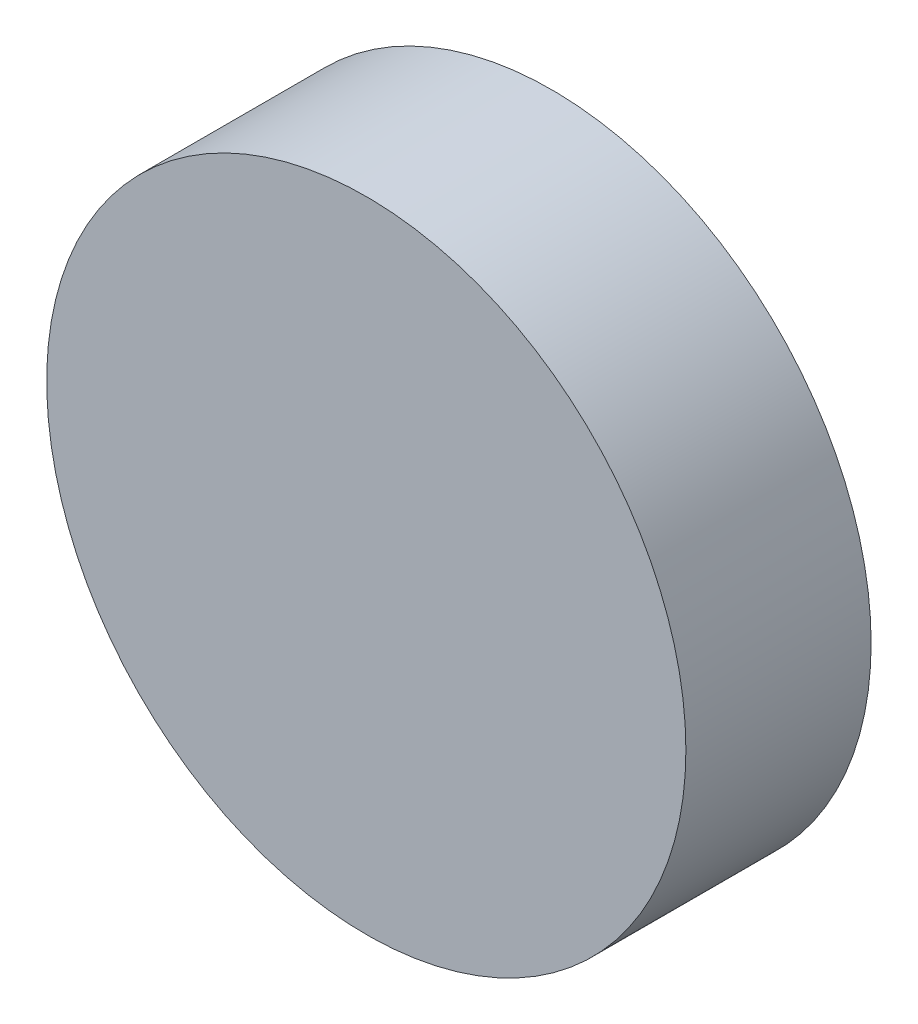
ISO-10303-21;
HEADER;
FILE_DESCRIPTION(('STEP AP214'),'2;1');
FILE_NAME('part.step','',(''),(''),'','','');
FILE_SCHEMA(('AUTOMOTIVE_DESIGN { 1 0 10303 214 1 1 1 1 }'));
ENDSEC;
DATA;
#1=APPLICATION_CONTEXT('core data for automotive mechanical design processes');
#2=APPLICATION_PROTOCOL_DEFINITION('international standard','automotive_design',2000,#1);
#3=PRODUCT_CONTEXT('',#1,'mechanical');
#4=PRODUCT('Part','Part','',(#3));
#5=PRODUCT_RELATED_PRODUCT_CATEGORY('part','',(#4));
#6=PRODUCT_DEFINITION_FORMATION('','',#4);
#7=PRODUCT_DEFINITION_CONTEXT('part definition',#1,'design');
#8=PRODUCT_DEFINITION('design','',#6,#7);
#9=PRODUCT_DEFINITION_SHAPE('','',#8);
#10=(LENGTH_UNIT() NAMED_UNIT(*) SI_UNIT(.MILLI.,.METRE.));
#11=(NAMED_UNIT(*) PLANE_ANGLE_UNIT() SI_UNIT($,.RADIAN.));
#12=(NAMED_UNIT(*) SI_UNIT($,.STERADIAN.) SOLID_ANGLE_UNIT());
#13=UNCERTAINTY_MEASURE_WITH_UNIT(LENGTH_MEASURE(1.E-05),#10,'distance_accuracy_value','');
#14=(GEOMETRIC_REPRESENTATION_CONTEXT(3) GLOBAL_UNCERTAINTY_ASSIGNED_CONTEXT((#13)) GLOBAL_UNIT_ASSIGNED_CONTEXT((#10,
#11,#12)) REPRESENTATION_CONTEXT('',''));
#15=CARTESIAN_POINT('',(0.,0.,0.));
#16=DIRECTION('',(0.,0.,1.));
#17=DIRECTION('',(1.,0.,0.));
#18=AXIS2_PLACEMENT_3D('',#15,#16,#17);
#19=CARTESIAN_POINT('',(0.,0.,15.));
#20=DIRECTION('',(0.,0.,-1.));
#21=DIRECTION('',(-1.,0.,0.));
#22=AXIS2_PLACEMENT_3D('',#19,#20,#21);
#23=CYLINDRICAL_SURFACE('',#22,25.8817639962983);
#24=CARTESIAN_POINT('',(0.,0.,15.));
#25=DIRECTION('',(0.,0.,1.));
#26=DIRECTION('',(1.,0.,0.));
#27=AXIS2_PLACEMENT_3D('',#24,#25,#26);
#28=CIRCLE('',#27,25.8817639962983);
#29=CARTESIAN_POINT('',(25.8817639962983,0.,15.));
#30=VERTEX_POINT('',#29);
#31=EDGE_CURVE('E10',#30,#30,#28,.T.);
#32=ORIENTED_EDGE('',*,*,#31,.F.);
#33=EDGE_LOOP('',(#32));
#34=FACE_BOUND('',#33,.T.);
#35=CARTESIAN_POINT('',(0.,0.,0.));
#36=DIRECTION('',(0.,0.,1.));
#37=DIRECTION('',(1.,0.,0.));
#38=AXIS2_PLACEMENT_3D('',#35,#36,#37);
#39=CIRCLE('',#38,25.8817639962983);
#40=CARTESIAN_POINT('',(25.8817639962983,0.,0.));
#41=VERTEX_POINT('',#40);
#42=EDGE_CURVE('E44',#41,#41,#39,.T.);
#43=ORIENTED_EDGE('',*,*,#42,.T.);
#44=EDGE_LOOP('',(#43));
#45=FACE_BOUND('',#44,.T.);
#46=ADVANCED_FACE('F41',(#34,#45),#23,.T.);
#47=CARTESIAN_POINT('',(0.,0.,15.));
#48=DIRECTION('',(0.,0.,1.));
#49=DIRECTION('',(1.,0.,0.));
#50=AXIS2_PLACEMENT_3D('',#47,#48,#49);
#51=PLANE('',#50);
#52=ORIENTED_EDGE('',*,*,#31,.T.);
#53=EDGE_LOOP('',(#52));
#54=FACE_BOUND('',#53,.T.);
#55=ADVANCED_FACE('F58',(#54),#51,.T.);
#56=CARTESIAN_POINT('',(0.,0.,0.));
#57=DIRECTION('',(0.,0.,1.));
#58=DIRECTION('',(1.,0.,0.));
#59=AXIS2_PLACEMENT_3D('',#56,#57,#58);
#60=PLANE('',#59);
#61=ORIENTED_EDGE('',*,*,#42,.F.);
#62=EDGE_LOOP('',(#61));
#63=FACE_BOUND('',#62,.T.);
#64=ADVANCED_FACE('F56',(#63),#60,.F.);
#65=CLOSED_SHELL('',(#46,#55,#64));
#66=MANIFOLD_SOLID_BREP('B2',#65);
#67=ADVANCED_BREP_SHAPE_REPRESENTATION('',(#18,#66),#14);
#68=SHAPE_DEFINITION_REPRESENTATION(#9,#67);
ENDSEC;
END-ISO-10303-21;
